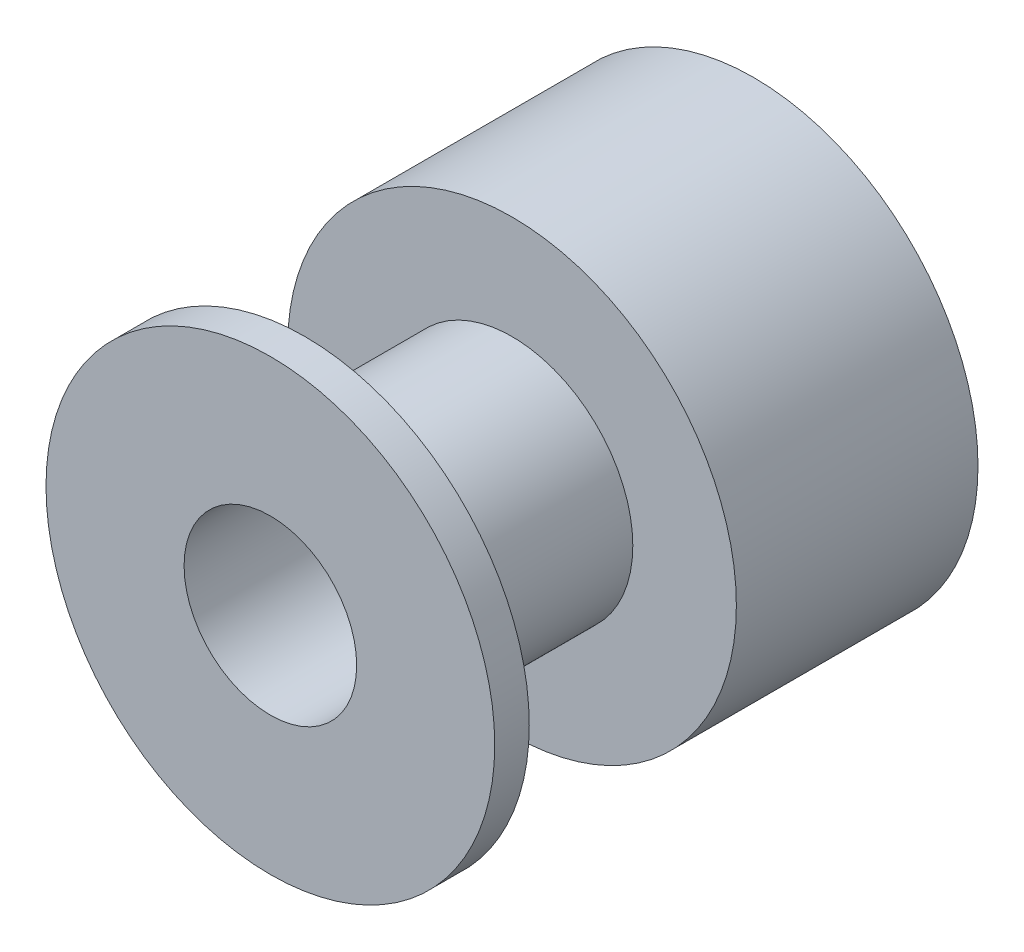
ISO-10303-21;
HEADER;
FILE_DESCRIPTION(('STEP AP214'),'2;1');
FILE_NAME('part.step','',(''),(''),'','','');
FILE_SCHEMA(('AUTOMOTIVE_DESIGN { 1 0 10303 214 1 1 1 1 }'));
ENDSEC;
DATA;
#1=APPLICATION_CONTEXT('core data for automotive mechanical design processes');
#2=APPLICATION_PROTOCOL_DEFINITION('international standard','automotive_design',2000,#1);
#3=PRODUCT_CONTEXT('',#1,'mechanical');
#4=PRODUCT('Part','Part','',(#3));
#5=PRODUCT_RELATED_PRODUCT_CATEGORY('part','',(#4));
#6=PRODUCT_DEFINITION_FORMATION('','',#4);
#7=PRODUCT_DEFINITION_CONTEXT('part definition',#1,'design');
#8=PRODUCT_DEFINITION('design','',#6,#7);
#9=PRODUCT_DEFINITION_SHAPE('','',#8);
#10=(LENGTH_UNIT() NAMED_UNIT(*) SI_UNIT(.MILLI.,.METRE.));
#11=(NAMED_UNIT(*) PLANE_ANGLE_UNIT() SI_UNIT($,.RADIAN.));
#12=(NAMED_UNIT(*) SI_UNIT($,.STERADIAN.) SOLID_ANGLE_UNIT());
#13=UNCERTAINTY_MEASURE_WITH_UNIT(LENGTH_MEASURE(1.E-05),#10,'distance_accuracy_value','');
#14=(GEOMETRIC_REPRESENTATION_CONTEXT(3) GLOBAL_UNCERTAINTY_ASSIGNED_CONTEXT((#13)) GLOBAL_UNIT_ASSIGNED_CONTEXT((#10,
#11,#12)) REPRESENTATION_CONTEXT('',''));
#15=CARTESIAN_POINT('',(0.,0.,0.));
#16=DIRECTION('',(0.,0.,1.));
#17=DIRECTION('',(1.,0.,0.));
#18=AXIS2_PLACEMENT_3D('',#15,#16,#17);
#19=CARTESIAN_POINT('',(0.,0.,1.));
#20=DIRECTION('',(0.,0.,-1.));
#21=DIRECTION('',(-1.,0.,0.));
#22=AXIS2_PLACEMENT_3D('',#19,#20,#21);
#23=CYLINDRICAL_SURFACE('',#22,6.5);
#24=CARTESIAN_POINT('',(0.,0.,1.));
#25=DIRECTION('',(0.,0.,1.));
#26=DIRECTION('',(1.,0.,0.));
#27=AXIS2_PLACEMENT_3D('',#24,#25,#26);
#28=CIRCLE('',#27,6.5);
#29=CARTESIAN_POINT('',(6.5,0.,1.));
#30=VERTEX_POINT('',#29);
#31=EDGE_CURVE('E39',#30,#30,#28,.T.);
#32=ORIENTED_EDGE('',*,*,#31,.F.);
#33=EDGE_LOOP('',(#32));
#34=FACE_BOUND('',#33,.T.);
#35=CARTESIAN_POINT('',(0.,0.,0.));
#36=DIRECTION('',(0.,0.,1.));
#37=DIRECTION('',(1.,0.,0.));
#38=AXIS2_PLACEMENT_3D('',#35,#36,#37);
#39=CIRCLE('',#38,6.5);
#40=CARTESIAN_POINT('',(6.5,0.,0.));
#41=VERTEX_POINT('',#40);
#42=EDGE_CURVE('E43',#41,#41,#39,.T.);
#43=ORIENTED_EDGE('',*,*,#42,.T.);
#44=EDGE_LOOP('',(#43));
#45=FACE_BOUND('',#44,.T.);
#46=ADVANCED_FACE('F33',(#34,#45),#23,.T.);
#47=CARTESIAN_POINT('',(0.,0.,1.));
#48=DIRECTION('',(0.,0.,1.));
#49=DIRECTION('',(1.,0.,0.));
#50=AXIS2_PLACEMENT_3D('',#47,#48,#49);
#51=PLANE('',#50);
#52=CARTESIAN_POINT('',(0.,0.,1.));
#53=DIRECTION('',(0.,0.,-1.));
#54=DIRECTION('',(-1.,0.,0.));
#55=AXIS2_PLACEMENT_3D('',#52,#53,#54);
#56=CIRCLE('',#55,2.5);
#57=CARTESIAN_POINT('',(-2.5,0.,1.));
#58=VERTEX_POINT('',#57);
#59=EDGE_CURVE('E56',#58,#58,#56,.T.);
#60=ORIENTED_EDGE('',*,*,#59,.T.);
#61=EDGE_LOOP('',(#60));
#62=FACE_BOUND('',#61,.T.);
#63=ORIENTED_EDGE('',*,*,#31,.T.);
#64=EDGE_LOOP('',(#63));
#65=FACE_BOUND('',#64,.T.);
#66=ADVANCED_FACE('F65',(#62,#65),#51,.T.);
#67=CARTESIAN_POINT('',(0.,0.,0.));
#68=DIRECTION('',(0.,0.,1.));
#69=DIRECTION('',(1.,0.,0.));
#70=AXIS2_PLACEMENT_3D('',#67,#68,#69);
#71=PLANE('',#70);
#72=CARTESIAN_POINT('',(0.,0.,0.));
#73=DIRECTION('',(0.,0.,1.));
#74=DIRECTION('',(1.,0.,0.));
#75=AXIS2_PLACEMENT_3D('',#72,#73,#74);
#76=CIRCLE('',#75,3.5);
#77=CARTESIAN_POINT('',(3.5,0.,0.));
#78=VERTEX_POINT('',#77);
#79=EDGE_CURVE('E10',#78,#78,#76,.F.);
#80=ORIENTED_EDGE('',*,*,#79,.F.);
#81=EDGE_LOOP('',(#80));
#82=FACE_BOUND('',#81,.T.);
#83=ORIENTED_EDGE('',*,*,#42,.F.);
#84=EDGE_LOOP('',(#83));
#85=FACE_BOUND('',#84,.T.);
#86=ADVANCED_FACE('F97',(#82,#85),#71,.F.);
#87=CARTESIAN_POINT('',(0.,0.,-6.));
#88=DIRECTION('',(0.,0.,1.));
#89=DIRECTION('',(1.,0.,0.));
#90=AXIS2_PLACEMENT_3D('',#87,#88,#89);
#91=CYLINDRICAL_SURFACE('',#90,3.5);
#92=CARTESIAN_POINT('',(0.,0.,-6.));
#93=DIRECTION('',(0.,0.,-1.));
#94=DIRECTION('',(-1.,0.,0.));
#95=AXIS2_PLACEMENT_3D('',#92,#93,#94);
#96=CIRCLE('',#95,3.5);
#97=CARTESIAN_POINT('',(-3.5,0.,-6.));
#98=VERTEX_POINT('',#97);
#99=EDGE_CURVE('E48',#98,#98,#96,.T.);
#100=ORIENTED_EDGE('',*,*,#99,.F.);
#101=EDGE_LOOP('',(#100));
#102=FACE_BOUND('',#101,.T.);
#103=ORIENTED_EDGE('',*,*,#79,.T.);
#104=EDGE_LOOP('',(#103));
#105=FACE_BOUND('',#104,.T.);
#106=ADVANCED_FACE('F83',(#102,#105),#91,.T.);
#107=CARTESIAN_POINT('',(0.,0.,-13.));
#108=DIRECTION('',(0.,0.,1.));
#109=DIRECTION('',(1.,0.,0.));
#110=AXIS2_PLACEMENT_3D('',#107,#108,#109);
#111=CYLINDRICAL_SURFACE('',#110,6.5);
#112=CARTESIAN_POINT('',(0.,0.,-13.));
#113=DIRECTION('',(0.,0.,-1.));
#114=DIRECTION('',(-1.,0.,0.));
#115=AXIS2_PLACEMENT_3D('',#112,#113,#114);
#116=CIRCLE('',#115,6.5);
#117=CARTESIAN_POINT('',(-6.5,0.,-13.));
#118=VERTEX_POINT('',#117);
#119=EDGE_CURVE('E52',#118,#118,#116,.T.);
#120=ORIENTED_EDGE('',*,*,#119,.F.);
#121=EDGE_LOOP('',(#120));
#122=FACE_BOUND('',#121,.T.);
#123=CARTESIAN_POINT('',(0.,0.,-6.));
#124=DIRECTION('',(0.,0.,-1.));
#125=DIRECTION('',(-1.,0.,0.));
#126=AXIS2_PLACEMENT_3D('',#123,#124,#125);
#127=CIRCLE('',#126,6.5);
#128=CARTESIAN_POINT('',(-6.5,0.,-6.));
#129=VERTEX_POINT('',#128);
#130=EDGE_CURVE('E53',#129,#129,#127,.T.);
#131=ORIENTED_EDGE('',*,*,#130,.T.);
#132=EDGE_LOOP('',(#131));
#133=FACE_BOUND('',#132,.T.);
#134=ADVANCED_FACE('F77',(#122,#133),#111,.T.);
#135=CARTESIAN_POINT('',(0.,0.,-13.));
#136=DIRECTION('',(0.,0.,-1.));
#137=DIRECTION('',(-1.,0.,0.));
#138=AXIS2_PLACEMENT_3D('',#135,#136,#137);
#139=PLANE('',#138);
#140=CARTESIAN_POINT('',(0.,0.,-13.));
#141=DIRECTION('',(0.,0.,-1.));
#142=DIRECTION('',(-1.,0.,0.));
#143=AXIS2_PLACEMENT_3D('',#140,#141,#142);
#144=CIRCLE('',#143,2.5);
#145=CARTESIAN_POINT('',(-2.5,0.,-13.));
#146=VERTEX_POINT('',#145);
#147=EDGE_CURVE('E59',#146,#146,#144,.T.);
#148=ORIENTED_EDGE('',*,*,#147,.F.);
#149=EDGE_LOOP('',(#148));
#150=FACE_BOUND('',#149,.T.);
#151=ORIENTED_EDGE('',*,*,#119,.T.);
#152=EDGE_LOOP('',(#151));
#153=FACE_BOUND('',#152,.T.);
#154=ADVANCED_FACE('F74',(#150,#153),#139,.T.);
#155=CARTESIAN_POINT('',(0.,0.,-6.));
#156=DIRECTION('',(0.,0.,-1.));
#157=DIRECTION('',(-1.,0.,0.));
#158=AXIS2_PLACEMENT_3D('',#155,#156,#157);
#159=PLANE('',#158);
#160=ORIENTED_EDGE('',*,*,#99,.T.);
#161=EDGE_LOOP('',(#160));
#162=FACE_BOUND('',#161,.T.);
#163=ORIENTED_EDGE('',*,*,#130,.F.);
#164=EDGE_LOOP('',(#163));
#165=FACE_BOUND('',#164,.T.);
#166=ADVANCED_FACE('F70',(#162,#165),#159,.F.);
#167=CARTESIAN_POINT('',(0.,0.,1.));
#168=DIRECTION('',(0.,0.,-1.));
#169=DIRECTION('',(-1.,0.,0.));
#170=AXIS2_PLACEMENT_3D('',#167,#168,#169);
#171=CYLINDRICAL_SURFACE('',#170,2.5);
#172=ORIENTED_EDGE('',*,*,#59,.F.);
#173=EDGE_LOOP('',(#172));
#174=FACE_BOUND('',#173,.T.);
#175=ORIENTED_EDGE('',*,*,#147,.T.);
#176=EDGE_LOOP('',(#175));
#177=FACE_BOUND('',#176,.T.);
#178=ADVANCED_FACE('F67',(#174,#177),#171,.F.);
#179=CLOSED_SHELL('',(#46,#66,#86,#106,#134,#154,#166,#178));
#180=MANIFOLD_SOLID_BREP('B2',#179);
#181=ADVANCED_BREP_SHAPE_REPRESENTATION('',(#18,#180),#14);
#182=SHAPE_DEFINITION_REPRESENTATION(#9,#181);
ENDSEC;
END-ISO-10303-21;
